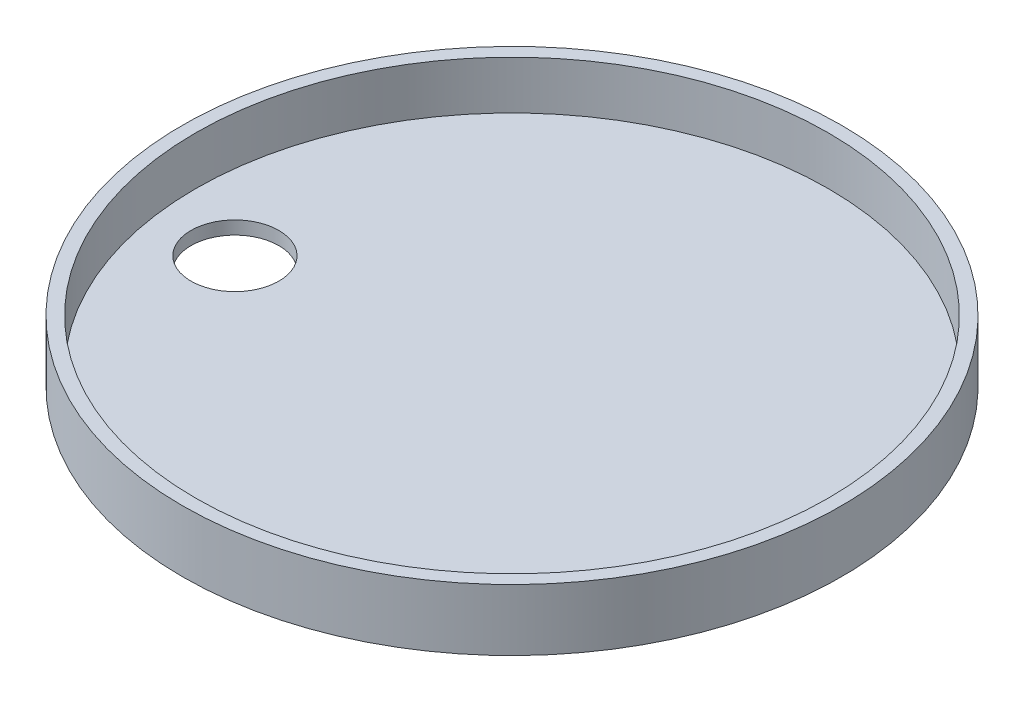
ISO-10303-21;
HEADER;
FILE_DESCRIPTION(('STEP AP214'),'2;1');
FILE_NAME('part.step','',(''),(''),'','','');
FILE_SCHEMA(('AUTOMOTIVE_DESIGN { 1 0 10303 214 1 1 1 1 }'));
ENDSEC;
DATA;
#1=APPLICATION_CONTEXT('core data for automotive mechanical design processes');
#2=APPLICATION_PROTOCOL_DEFINITION('international standard','automotive_design',2000,#1);
#3=PRODUCT_CONTEXT('',#1,'mechanical');
#4=PRODUCT('Part','Part','',(#3));
#5=PRODUCT_RELATED_PRODUCT_CATEGORY('part','',(#4));
#6=PRODUCT_DEFINITION_FORMATION('','',#4);
#7=PRODUCT_DEFINITION_CONTEXT('part definition',#1,'design');
#8=PRODUCT_DEFINITION('design','',#6,#7);
#9=PRODUCT_DEFINITION_SHAPE('','',#8);
#10=(LENGTH_UNIT() NAMED_UNIT(*) SI_UNIT(.MILLI.,.METRE.));
#11=(NAMED_UNIT(*) PLANE_ANGLE_UNIT() SI_UNIT($,.RADIAN.));
#12=(NAMED_UNIT(*) SI_UNIT($,.STERADIAN.) SOLID_ANGLE_UNIT());
#13=UNCERTAINTY_MEASURE_WITH_UNIT(LENGTH_MEASURE(1.E-05),#10,'distance_accuracy_value','');
#14=(GEOMETRIC_REPRESENTATION_CONTEXT(3) GLOBAL_UNCERTAINTY_ASSIGNED_CONTEXT((#13)) GLOBAL_UNIT_ASSIGNED_CONTEXT((#10,
#11,#12)) REPRESENTATION_CONTEXT('',''));
#15=CARTESIAN_POINT('',(0.,0.,0.));
#16=DIRECTION('',(0.,0.,1.));
#17=DIRECTION('',(1.,0.,0.));
#18=AXIS2_PLACEMENT_3D('',#15,#16,#17);
#19=CARTESIAN_POINT('',(0.,3.81,0.));
#20=DIRECTION('',(0.,-1.,0.));
#21=DIRECTION('',(0.,0.,-1.));
#22=AXIS2_PLACEMENT_3D('',#19,#20,#21);
#23=CYLINDRICAL_SURFACE('',#22,95.25);
#24=CARTESIAN_POINT('',(0.,0.,0.));
#25=DIRECTION('',(0.,1.,0.));
#26=DIRECTION('',(0.,0.,1.));
#27=AXIS2_PLACEMENT_3D('',#24,#25,#26);
#28=CIRCLE('',#27,95.25);
#29=CARTESIAN_POINT('',(0.,0.,-95.25));
#30=VERTEX_POINT('',#29);
#31=EDGE_CURVE('E37',#30,#30,#28,.T.);
#32=CARTESIAN_POINT('',(0.,17.78,0.));
#33=DIRECTION('',(0.,1.,0.));
#34=DIRECTION('',(0.,0.,1.));
#35=AXIS2_PLACEMENT_3D('',#32,#33,#34);
#36=CIRCLE('',#35,95.25);
#37=CARTESIAN_POINT('',(0.,17.78,-95.25));
#38=VERTEX_POINT('',#37);
#39=EDGE_CURVE('E41',#38,#38,#36,.T.);
#40=CARTESIAN_POINT('',(0.,0.,-95.25));
#41=CARTESIAN_POINT('',(0.,0.185208333333333,-95.25));
#42=CARTESIAN_POINT('',(0.,0.370416666666667,-95.25));
#43=CARTESIAN_POINT('',(0.,0.740833333333333,-95.25));
#44=CARTESIAN_POINT('',(0.,0.926041666666667,-95.25));
#45=CARTESIAN_POINT('',(0.,1.29645833333333,-95.25));
#46=CARTESIAN_POINT('',(0.,1.48166666666667,-95.25));
#47=CARTESIAN_POINT('',(0.,1.85208333333333,-95.25));
#48=CARTESIAN_POINT('',(0.,2.03729166666667,-95.25));
#49=CARTESIAN_POINT('',(0.,2.40770833333333,-95.25));
#50=CARTESIAN_POINT('',(0.,2.59291666666667,-95.25));
#51=CARTESIAN_POINT('',(0.,2.96333333333333,-95.25));
#52=CARTESIAN_POINT('',(0.,3.14854166666667,-95.25));
#53=CARTESIAN_POINT('',(0.,3.51895833333333,-95.25));
#54=CARTESIAN_POINT('',(0.,3.70416666666667,-95.25));
#55=CARTESIAN_POINT('',(0.,4.07458333333333,-95.25));
#56=CARTESIAN_POINT('',(0.,4.25979166666667,-95.25));
#57=CARTESIAN_POINT('',(0.,4.63020833333333,-95.25));
#58=CARTESIAN_POINT('',(0.,4.81541666666667,-95.25));
#59=CARTESIAN_POINT('',(0.,5.18583333333333,-95.25));
#60=CARTESIAN_POINT('',(0.,5.37104166666667,-95.25));
#61=CARTESIAN_POINT('',(0.,5.74145833333333,-95.25));
#62=CARTESIAN_POINT('',(0.,5.92666666666667,-95.25));
#63=CARTESIAN_POINT('',(0.,6.29708333333333,-95.25));
#64=CARTESIAN_POINT('',(0.,6.48229166666667,-95.25));
#65=CARTESIAN_POINT('',(0.,6.85270833333333,-95.25));
#66=CARTESIAN_POINT('',(0.,7.03791666666667,-95.25));
#67=CARTESIAN_POINT('',(0.,7.40833333333333,-95.25));
#68=CARTESIAN_POINT('',(0.,7.59354166666667,-95.25));
#69=CARTESIAN_POINT('',(0.,7.96395833333333,-95.25));
#70=CARTESIAN_POINT('',(0.,8.14916666666667,-95.25));
#71=CARTESIAN_POINT('',(0.,8.51958333333333,-95.25));
#72=CARTESIAN_POINT('',(0.,8.70479166666667,-95.25));
#73=CARTESIAN_POINT('',(0.,9.07520833333333,-95.25));
#74=CARTESIAN_POINT('',(0.,9.26041666666666,-95.25));
#75=CARTESIAN_POINT('',(0.,9.63083333333333,-95.25));
#76=CARTESIAN_POINT('',(0.,9.81604166666667,-95.25));
#77=CARTESIAN_POINT('',(0.,10.1864583333333,-95.25));
#78=CARTESIAN_POINT('',(0.,10.3716666666667,-95.25));
#79=CARTESIAN_POINT('',(0.,10.7420833333333,-95.25));
#80=CARTESIAN_POINT('',(0.,10.9272916666667,-95.25));
#81=CARTESIAN_POINT('',(0.,11.2977083333333,-95.25));
#82=CARTESIAN_POINT('',(0.,11.4829166666667,-95.25));
#83=CARTESIAN_POINT('',(0.,11.8533333333333,-95.25));
#84=CARTESIAN_POINT('',(0.,12.0385416666667,-95.25));
#85=CARTESIAN_POINT('',(0.,12.4089583333333,-95.25));
#86=CARTESIAN_POINT('',(0.,12.5941666666667,-95.25));
#87=CARTESIAN_POINT('',(0.,12.9645833333333,-95.25));
#88=CARTESIAN_POINT('',(0.,13.1497916666667,-95.25));
#89=CARTESIAN_POINT('',(0.,13.5202083333333,-95.25));
#90=CARTESIAN_POINT('',(0.,13.7054166666667,-95.25));
#91=CARTESIAN_POINT('',(0.,14.0758333333333,-95.25));
#92=CARTESIAN_POINT('',(0.,14.2610416666667,-95.25));
#93=CARTESIAN_POINT('',(0.,14.6314583333333,-95.25));
#94=CARTESIAN_POINT('',(0.,14.8166666666667,-95.25));
#95=CARTESIAN_POINT('',(0.,15.1870833333333,-95.25));
#96=CARTESIAN_POINT('',(0.,15.3722916666667,-95.25));
#97=CARTESIAN_POINT('',(0.,15.7427083333333,-95.25));
#98=CARTESIAN_POINT('',(0.,15.9279166666667,-95.25));
#99=CARTESIAN_POINT('',(0.,16.2983333333333,-95.25));
#100=CARTESIAN_POINT('',(0.,16.4835416666667,-95.25));
#101=CARTESIAN_POINT('',(0.,16.8539583333333,-95.25));
#102=CARTESIAN_POINT('',(0.,17.0391666666667,-95.25));
#103=CARTESIAN_POINT('',(0.,17.4095833333333,-95.25));
#104=CARTESIAN_POINT('',(0.,17.5947916666667,-95.25));
#105=CARTESIAN_POINT('',(0.,17.78,-95.25));
#106=B_SPLINE_CURVE_WITH_KNOTS('',3,(#40,#41,#42,#43,#44,#45,#46,#47,#48,#49,#50,#51,#52,#53,
#54,#55,#56,#57,#58,#59,#60,#61,#62,#63,#64,#65,#66,#67,#68,#69,#70,#71,#72,#73,#74,#75,#76,#77,
#78,#79,#80,#81,#82,#83,#84,#85,#86,#87,#88,#89,#90,#91,#92,#93,#94,#95,#96,#97,#98,#99,#100,
#101,#102,#103,#104,#105),.UNSPECIFIED.,.F.,.F.,(4,2,2,2,2,2,2,2,2,2,2,2,2,2,2,2,2,2,2,2,2,2,2,
2,2,2,2,2,2,2,2,2,4),(0.,0.555625,1.11125,1.666875,2.2225,2.778125,3.33375,3.889375,4.445,
5.000625,5.55625,6.111875,6.6675,7.223125,7.77875,8.334375,8.89,9.445625,10.00125,10.556875,
11.1125,11.668125,12.22375,12.779375,13.335,13.890625,14.44625,15.001875,15.5575,16.113125,
16.66875,17.224375,17.78),.UNSPECIFIED.);
#107=EDGE_CURVE('BSEAM30',#30,#38,#106,.T.);
#108=ORIENTED_EDGE('',*,*,#31,.T.);
#109=ORIENTED_EDGE('',*,*,#39,.F.);
#110=ORIENTED_EDGE('',*,*,#107,.T.);
#111=ORIENTED_EDGE('',*,*,#107,.F.);
#112=EDGE_LOOP('',(#108,#110,#109,#111));
#113=FACE_BOUND('',#112,.T.);
#114=ADVANCED_FACE('F30',(#113),#23,.T.);
#115=CARTESIAN_POINT('',(0.,0.,0.));
#116=DIRECTION('',(0.,1.,0.));
#117=DIRECTION('',(0.,0.,1.));
#118=AXIS2_PLACEMENT_3D('',#115,#116,#117);
#119=PLANE('',#118);
#120=CARTESIAN_POINT('',(-68.9581522944509,0.,11.126353047397));
#121=DIRECTION('',(0.,-1.,0.));
#122=DIRECTION('',(0.,0.,-1.));
#123=AXIS2_PLACEMENT_3D('',#120,#121,#122);
#124=CIRCLE('',#123,12.7);
#125=CARTESIAN_POINT('',(-68.9581522944509,0.,-1.57364695260302));
#126=VERTEX_POINT('',#125);
#127=EDGE_CURVE('E49',#126,#126,#124,.T.);
#128=ORIENTED_EDGE('',*,*,#127,.F.);
#129=EDGE_LOOP('',(#128));
#130=FACE_BOUND('',#129,.T.);
#131=ORIENTED_EDGE('',*,*,#31,.F.);
#132=EDGE_LOOP('',(#131));
#133=FACE_BOUND('',#132,.T.);
#134=ADVANCED_FACE('F73',(#130,#133),#119,.F.);
#135=CARTESIAN_POINT('',(0.,17.78,0.));
#136=DIRECTION('',(0.,1.,0.));
#137=DIRECTION('',(0.,0.,1.));
#138=AXIS2_PLACEMENT_3D('',#135,#136,#137);
#139=PLANE('',#138);
#140=ORIENTED_EDGE('',*,*,#39,.T.);
#141=EDGE_LOOP('',(#140));
#142=FACE_BOUND('',#141,.T.);
#143=CARTESIAN_POINT('',(0.,17.78,0.));
#144=DIRECTION('',(0.,1.,0.));
#145=DIRECTION('',(0.,0.,1.));
#146=AXIS2_PLACEMENT_3D('',#143,#144,#145);
#147=CIRCLE('',#146,91.44);
#148=CARTESIAN_POINT('',(0.,17.78,91.44));
#149=VERTEX_POINT('',#148);
#150=EDGE_CURVE('E46',#149,#149,#147,.T.);
#151=ORIENTED_EDGE('',*,*,#150,.F.);
#152=EDGE_LOOP('',(#151));
#153=FACE_BOUND('',#152,.T.);
#154=ADVANCED_FACE('F68',(#142,#153),#139,.T.);
#155=CARTESIAN_POINT('',(0.,17.78,0.));
#156=DIRECTION('',(0.,-1.,0.));
#157=DIRECTION('',(0.,0.,-1.));
#158=AXIS2_PLACEMENT_3D('',#155,#156,#157);
#159=CYLINDRICAL_SURFACE('',#158,91.44);
#160=ORIENTED_EDGE('',*,*,#150,.T.);
#161=EDGE_LOOP('',(#160));
#162=FACE_BOUND('',#161,.T.);
#163=CARTESIAN_POINT('',(0.,3.81,0.));
#164=DIRECTION('',(0.,1.,0.));
#165=DIRECTION('',(0.,0.,1.));
#166=AXIS2_PLACEMENT_3D('',#163,#164,#165);
#167=CIRCLE('',#166,91.44);
#168=CARTESIAN_POINT('',(0.,3.81,91.44));
#169=VERTEX_POINT('',#168);
#170=EDGE_CURVE('E10',#169,#169,#167,.F.);
#171=ORIENTED_EDGE('',*,*,#170,.T.);
#172=EDGE_LOOP('',(#171));
#173=FACE_BOUND('',#172,.T.);
#174=ADVANCED_FACE('F61',(#162,#173),#159,.F.);
#175=CARTESIAN_POINT('',(0.,3.81,0.));
#176=DIRECTION('',(0.,1.,0.));
#177=DIRECTION('',(0.,0.,1.));
#178=AXIS2_PLACEMENT_3D('',#175,#176,#177);
#179=PLANE('',#178);
#180=CARTESIAN_POINT('',(-68.9581522944509,3.81,11.126353047397));
#181=DIRECTION('',(0.,1.,0.));
#182=DIRECTION('',(0.,0.,1.));
#183=AXIS2_PLACEMENT_3D('',#180,#181,#182);
#184=CIRCLE('',#183,12.7);
#185=CARTESIAN_POINT('',(-68.9581522944509,3.81,-1.57364695260302));
#186=VERTEX_POINT('',#185);
#187=EDGE_CURVE('E33',#186,#186,#184,.T.);
#188=ORIENTED_EDGE('',*,*,#187,.F.);
#189=EDGE_LOOP('',(#188));
#190=FACE_BOUND('',#189,.T.);
#191=ORIENTED_EDGE('',*,*,#170,.F.);
#192=EDGE_LOOP('',(#191));
#193=FACE_BOUND('',#192,.T.);
#194=ADVANCED_FACE('F58',(#190,#193),#179,.T.);
#195=CARTESIAN_POINT('',(-68.9581522944509,17.78,11.126353047397));
#196=DIRECTION('',(0.,-1.,0.));
#197=DIRECTION('',(0.,0.,-1.));
#198=AXIS2_PLACEMENT_3D('',#195,#196,#197);
#199=CYLINDRICAL_SURFACE('',#198,12.7);
#200=CARTESIAN_POINT('',(-68.9581522944509,3.81,-1.57364695260302));
#201=CARTESIAN_POINT('',(-68.9581522944509,3.7703125,-1.57364695260302));
#202=CARTESIAN_POINT('',(-68.9581522944509,3.730625,-1.57364695260302));
#203=CARTESIAN_POINT('',(-68.9581522944509,3.65125,-1.57364695260302));
#204=CARTESIAN_POINT('',(-68.9581522944509,3.6115625,-1.57364695260302));
#205=CARTESIAN_POINT('',(-68.9581522944509,3.5321875,-1.57364695260302));
#206=CARTESIAN_POINT('',(-68.9581522944509,3.4925,-1.57364695260302));
#207=CARTESIAN_POINT('',(-68.9581522944509,3.413125,-1.57364695260302));
#208=CARTESIAN_POINT('',(-68.9581522944509,3.3734375,-1.57364695260302));
#209=CARTESIAN_POINT('',(-68.9581522944509,3.2940625,-1.57364695260302));
#210=CARTESIAN_POINT('',(-68.9581522944509,3.254375,-1.57364695260302));
#211=CARTESIAN_POINT('',(-68.9581522944509,3.175,-1.57364695260302));
#212=CARTESIAN_POINT('',(-68.9581522944509,3.1353125,-1.57364695260302));
#213=CARTESIAN_POINT('',(-68.9581522944509,3.0559375,-1.57364695260302));
#214=CARTESIAN_POINT('',(-68.9581522944509,3.01625,-1.57364695260302));
#215=CARTESIAN_POINT('',(-68.9581522944509,2.936875,-1.57364695260302));
#216=CARTESIAN_POINT('',(-68.9581522944509,2.8971875,-1.57364695260302));
#217=CARTESIAN_POINT('',(-68.9581522944509,2.8178125,-1.57364695260302));
#218=CARTESIAN_POINT('',(-68.9581522944509,2.778125,-1.57364695260302));
#219=CARTESIAN_POINT('',(-68.9581522944509,2.69875,-1.57364695260302));
#220=CARTESIAN_POINT('',(-68.9581522944509,2.6590625,-1.57364695260302));
#221=CARTESIAN_POINT('',(-68.9581522944509,2.5796875,-1.57364695260302));
#222=CARTESIAN_POINT('',(-68.9581522944509,2.54,-1.57364695260302));
#223=CARTESIAN_POINT('',(-68.9581522944509,2.460625,-1.57364695260302));
#224=CARTESIAN_POINT('',(-68.9581522944509,2.4209375,-1.57364695260302));
#225=CARTESIAN_POINT('',(-68.9581522944509,2.3415625,-1.57364695260302));
#226=CARTESIAN_POINT('',(-68.9581522944509,2.301875,-1.57364695260302));
#227=CARTESIAN_POINT('',(-68.9581522944509,2.2225,-1.57364695260302));
#228=CARTESIAN_POINT('',(-68.9581522944509,2.1828125,-1.57364695260302));
#229=CARTESIAN_POINT('',(-68.9581522944509,2.1034375,-1.57364695260302));
#230=CARTESIAN_POINT('',(-68.9581522944509,2.06375,-1.57364695260302));
#231=CARTESIAN_POINT('',(-68.9581522944509,1.984375,-1.57364695260302));
#232=CARTESIAN_POINT('',(-68.9581522944509,1.9446875,-1.57364695260302));
#233=CARTESIAN_POINT('',(-68.9581522944509,1.8653125,-1.57364695260302));
#234=CARTESIAN_POINT('',(-68.9581522944509,1.825625,-1.57364695260302));
#235=CARTESIAN_POINT('',(-68.9581522944509,1.74625,-1.57364695260302));
#236=CARTESIAN_POINT('',(-68.9581522944509,1.7065625,-1.57364695260302));
#237=CARTESIAN_POINT('',(-68.9581522944509,1.6271875,-1.57364695260302));
#238=CARTESIAN_POINT('',(-68.9581522944509,1.5875,-1.57364695260302));
#239=CARTESIAN_POINT('',(-68.9581522944509,1.508125,-1.57364695260302));
#240=CARTESIAN_POINT('',(-68.9581522944509,1.4684375,-1.57364695260302));
#241=CARTESIAN_POINT('',(-68.9581522944509,1.3890625,-1.57364695260302));
#242=CARTESIAN_POINT('',(-68.9581522944509,1.349375,-1.57364695260302));
#243=CARTESIAN_POINT('',(-68.9581522944509,1.27,-1.57364695260302));
#244=CARTESIAN_POINT('',(-68.9581522944509,1.2303125,-1.57364695260302));
#245=CARTESIAN_POINT('',(-68.9581522944509,1.1509375,-1.57364695260302));
#246=CARTESIAN_POINT('',(-68.9581522944509,1.11125,-1.57364695260302));
#247=CARTESIAN_POINT('',(-68.9581522944509,1.031875,-1.57364695260302));
#248=CARTESIAN_POINT('',(-68.9581522944509,0.992187500000002,-1.57364695260302));
#249=CARTESIAN_POINT('',(-68.9581522944509,0.912812500000001,-1.57364695260302));
#250=CARTESIAN_POINT('',(-68.9581522944509,0.873125,-1.57364695260302));
#251=CARTESIAN_POINT('',(-68.9581522944509,0.793749999999999,-1.57364695260302));
#252=CARTESIAN_POINT('',(-68.9581522944509,0.7540625,-1.57364695260302));
#253=CARTESIAN_POINT('',(-68.9581522944509,0.6746875,-1.57364695260302));
#254=CARTESIAN_POINT('',(-68.9581522944509,0.635,-1.57364695260302));
#255=CARTESIAN_POINT('',(-68.9581522944509,0.555625000000001,-1.57364695260302));
#256=CARTESIAN_POINT('',(-68.9581522944509,0.515937500000001,-1.57364695260302));
#257=CARTESIAN_POINT('',(-68.9581522944509,0.436562500000001,-1.57364695260302));
#258=CARTESIAN_POINT('',(-68.9581522944509,0.396875000000001,-1.57364695260302));
#259=CARTESIAN_POINT('',(-68.9581522944509,0.317500000000001,-1.57364695260302));
#260=CARTESIAN_POINT('',(-68.9581522944509,0.2778125,-1.57364695260302));
#261=CARTESIAN_POINT('',(-68.9581522944509,0.198437499999999,-1.57364695260302));
#262=CARTESIAN_POINT('',(-68.9581522944509,0.158749999999999,-1.57364695260302));
#263=CARTESIAN_POINT('',(-68.9581522944509,0.0793749999999996,-1.57364695260302));
#264=CARTESIAN_POINT('',(-68.9581522944509,0.0396874999999998,-1.57364695260302));
#265=CARTESIAN_POINT('',(-68.9581522944509,0.,-1.57364695260302));
#266=B_SPLINE_CURVE_WITH_KNOTS('',3,(#200,#201,#202,#203,#204,#205,#206,#207,#208,#209,#210,
#211,#212,#213,#214,#215,#216,#217,#218,#219,#220,#221,#222,#223,#224,#225,#226,#227,#228,#229,
#230,#231,#232,#233,#234,#235,#236,#237,#238,#239,#240,#241,#242,#243,#244,#245,#246,#247,#248,
#249,#250,#251,#252,#253,#254,#255,#256,#257,#258,#259,#260,#261,#262,#263,#264,#265),
.UNSPECIFIED.,.F.,.F.,(4,2,2,2,2,2,2,2,2,2,2,2,2,2,2,2,2,2,2,2,2,2,2,2,2,2,2,2,2,2,2,2,4),(0.,
0.119062499999999,0.238125,0.3571875,0.476250000000001,0.5953125,0.714375,0.833437500000001,
0.9525,1.0715625,1.190625,1.3096875,1.42875,1.5478125,1.666875,1.7859375,1.905,2.0240625,
2.143125,2.2621875,2.38125,2.5003125,2.619375,2.7384375,2.8575,2.9765625,3.095625,3.2146875,
3.33375,3.4528125,3.571875,3.6909375,3.81),.UNSPECIFIED.);
#267=EDGE_CURVE('BSEAM56',#186,#126,#266,.T.);
#268=ORIENTED_EDGE('',*,*,#187,.T.);
#269=ORIENTED_EDGE('',*,*,#127,.T.);
#270=ORIENTED_EDGE('',*,*,#267,.T.);
#271=ORIENTED_EDGE('',*,*,#267,.F.);
#272=EDGE_LOOP('',(#268,#270,#269,#271));
#273=FACE_BOUND('',#272,.T.);
#274=ADVANCED_FACE('F56',(#273),#199,.F.);
#275=CLOSED_SHELL('',(#114,#134,#154,#174,#194,#274));
#276=MANIFOLD_SOLID_BREP('B2',#275);
#277=ADVANCED_BREP_SHAPE_REPRESENTATION('',(#18,#276),#14);
#278=SHAPE_DEFINITION_REPRESENTATION(#9,#277);
ENDSEC;
END-ISO-10303-21;
